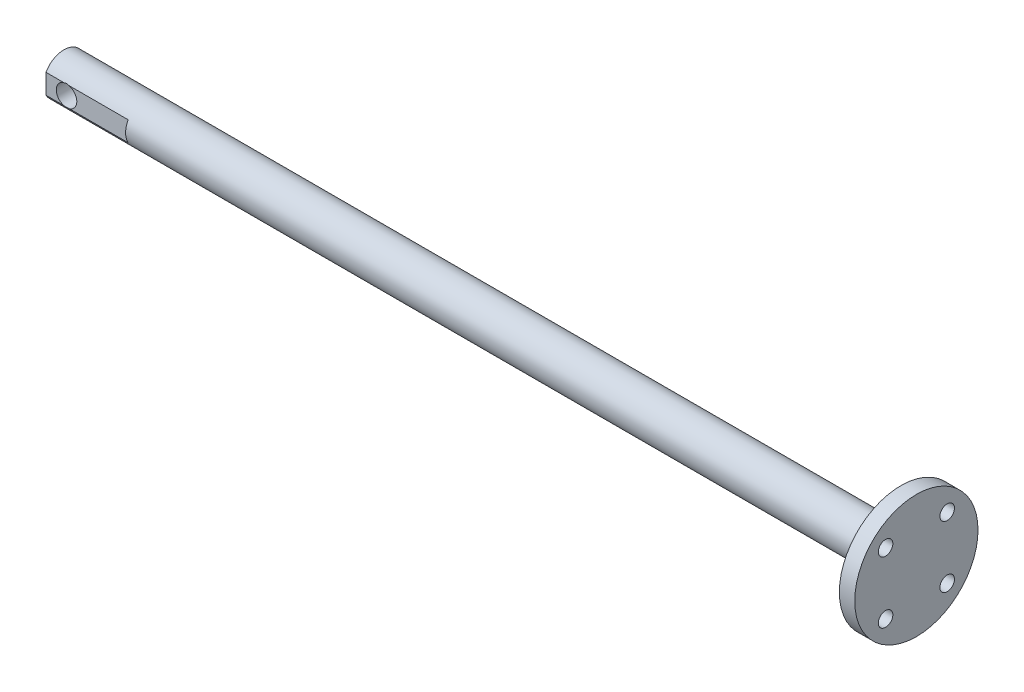
ISO-10303-21;
HEADER;
FILE_DESCRIPTION(('STEP AP214'),'2;1');
FILE_NAME('part.step','',(''),(''),'','','');
FILE_SCHEMA(('AUTOMOTIVE_DESIGN { 1 0 10303 214 1 1 1 1 }'));
ENDSEC;
DATA;
#1=APPLICATION_CONTEXT('core data for automotive mechanical design processes');
#2=APPLICATION_PROTOCOL_DEFINITION('international standard','automotive_design',2000,#1);
#3=PRODUCT_CONTEXT('',#1,'mechanical');
#4=PRODUCT('Part','Part','',(#3));
#5=PRODUCT_RELATED_PRODUCT_CATEGORY('part','',(#4));
#6=PRODUCT_DEFINITION_FORMATION('','',#4);
#7=PRODUCT_DEFINITION_CONTEXT('part definition',#1,'design');
#8=PRODUCT_DEFINITION('design','',#6,#7);
#9=PRODUCT_DEFINITION_SHAPE('','',#8);
#10=(LENGTH_UNIT() NAMED_UNIT(*) SI_UNIT(.MILLI.,.METRE.));
#11=(NAMED_UNIT(*) PLANE_ANGLE_UNIT() SI_UNIT($,.RADIAN.));
#12=(NAMED_UNIT(*) SI_UNIT($,.STERADIAN.) SOLID_ANGLE_UNIT());
#13=UNCERTAINTY_MEASURE_WITH_UNIT(LENGTH_MEASURE(1.E-05),#10,'distance_accuracy_value','');
#14=(GEOMETRIC_REPRESENTATION_CONTEXT(3) GLOBAL_UNCERTAINTY_ASSIGNED_CONTEXT((#13)) GLOBAL_UNIT_ASSIGNED_CONTEXT((#10,
#11,#12)) REPRESENTATION_CONTEXT('',''));
#15=CARTESIAN_POINT('',(0.,0.,0.));
#16=DIRECTION('',(0.,0.,1.));
#17=DIRECTION('',(1.,0.,0.));
#18=AXIS2_PLACEMENT_3D('',#15,#16,#17);
#19=CARTESIAN_POINT('',(0.,-19.05,-5.55625));
#20=DIRECTION('',(0.,0.,1.));
#21=DIRECTION('',(1.,0.,0.));
#22=AXIS2_PLACEMENT_3D('',#19,#20,#21);
#23=PLANE('',#22);
#24=CARTESIAN_POINT('',(6.35,0.,-5.55625));
#25=DIRECTION('',(0.,0.,-1.));
#26=DIRECTION('',(-1.,0.,0.));
#27=AXIS2_PLACEMENT_3D('',#24,#25,#26);
#28=CIRCLE('',#27,3.17499999999999);
#29=CARTESIAN_POINT('',(7.14374999999996,3.07418053105213,-5.55625));
#30=VERTEX_POINT('',#29);
#31=CARTESIAN_POINT('',(7.14374999999996,-3.07418053105213,-5.55625));
#32=VERTEX_POINT('',#31);
#33=EDGE_CURVE('E101',#30,#32,#28,.T.);
#34=ORIENTED_EDGE('',*,*,#33,.F.);
#35=DIRECTION('',(-1.,0.,0.));
#36=VECTOR('',#35,1.);
#37=CARTESIAN_POINT('',(-16.5206638695174,3.07418053105214,-5.55625));
#38=LINE('',#37,#36);
#39=CARTESIAN_POINT('',(25.4,3.07418053105213,-5.55625));
#40=VERTEX_POINT('',#39);
#41=EDGE_CURVE('E111',#30,#40,#38,.F.);
#42=ORIENTED_EDGE('',*,*,#41,.T.);
#43=DIRECTION('',(0.,1.,0.));
#44=VECTOR('',#43,1.);
#45=CARTESIAN_POINT('',(25.4,-19.05,-5.55625));
#46=LINE('',#45,#44);
#47=CARTESIAN_POINT('',(25.4,-3.07418053105215,-5.55625));
#48=VERTEX_POINT('',#47);
#49=EDGE_CURVE('E243',#48,#40,#46,.T.);
#50=ORIENTED_EDGE('',*,*,#49,.F.);
#51=DIRECTION('',(-1.,0.,0.));
#52=VECTOR('',#51,1.);
#53=CARTESIAN_POINT('',(-16.5206638695174,-3.07418053105214,-5.55625));
#54=LINE('',#53,#52);
#55=EDGE_CURVE('E114',#48,#32,#54,.T.);
#56=ORIENTED_EDGE('',*,*,#55,.T.);
#57=EDGE_LOOP('',(#34,#42,#50,#56));
#58=FACE_BOUND('',#57,.T.);
#59=ADVANCED_FACE('F33',(#58),#23,.F.);
#60=CARTESIAN_POINT('',(5.55625000000004,-3.07418053105213,-5.55625));
#61=VERTEX_POINT('',#60);
#62=CARTESIAN_POINT('',(5.55625000000006,3.07418053105214,-5.55625));
#63=VERTEX_POINT('',#62);
#64=EDGE_CURVE('E52',#61,#63,#28,.T.);
#65=ORIENTED_EDGE('',*,*,#64,.F.);
#66=CARTESIAN_POINT('',(0.,-3.07418053105214,-5.55625));
#67=VERTEX_POINT('',#66);
#68=EDGE_CURVE('E123',#61,#67,#54,.T.);
#69=ORIENTED_EDGE('',*,*,#68,.T.);
#70=DIRECTION('',(0.,-1.,0.));
#71=VECTOR('',#70,1.);
#72=CARTESIAN_POINT('',(0.,0.,-5.55625));
#73=LINE('',#72,#71);
#74=CARTESIAN_POINT('',(0.,3.07418053105213,-5.55625));
#75=VERTEX_POINT('',#74);
#76=EDGE_CURVE('E139',#75,#67,#73,.T.);
#77=ORIENTED_EDGE('',*,*,#76,.F.);
#78=EDGE_CURVE('E120',#75,#63,#38,.F.);
#79=ORIENTED_EDGE('',*,*,#78,.T.);
#80=EDGE_LOOP('',(#65,#69,#77,#79));
#81=FACE_BOUND('',#80,.T.);
#82=ADVANCED_FACE('F180',(#81),#23,.F.);
#83=CARTESIAN_POINT('',(0.,-19.05,5.55625));
#84=DIRECTION('',(0.,0.,-1.));
#85=DIRECTION('',(-1.,0.,0.));
#86=AXIS2_PLACEMENT_3D('',#83,#84,#85);
#87=PLANE('',#86);
#88=DIRECTION('',(-1.,0.,0.));
#89=VECTOR('',#88,1.);
#90=CARTESIAN_POINT('',(-16.5206638695174,3.07418053105214,5.55625));
#91=LINE('',#90,#89);
#92=CARTESIAN_POINT('',(25.4,3.07418053105214,5.55625));
#93=VERTEX_POINT('',#92);
#94=CARTESIAN_POINT('',(7.14374999999994,3.07418053105214,5.55625));
#95=VERTEX_POINT('',#94);
#96=EDGE_CURVE('E228',#93,#95,#91,.T.);
#97=ORIENTED_EDGE('',*,*,#96,.T.);
#98=CARTESIAN_POINT('',(6.35,0.,5.55625));
#99=DIRECTION('',(0.,0.,-1.));
#100=DIRECTION('',(-1.,0.,0.));
#101=AXIS2_PLACEMENT_3D('',#98,#99,#100);
#102=CIRCLE('',#101,3.17499999999999);
#103=CARTESIAN_POINT('',(7.14374999999994,-3.07418053105214,5.55625));
#104=VERTEX_POINT('',#103);
#105=EDGE_CURVE('E229',#95,#104,#102,.T.);
#106=ORIENTED_EDGE('',*,*,#105,.T.);
#107=DIRECTION('',(-1.,0.,0.));
#108=VECTOR('',#107,1.);
#109=CARTESIAN_POINT('',(-16.5206638695174,-3.07418053105214,5.55625));
#110=LINE('',#109,#108);
#111=CARTESIAN_POINT('',(25.4,-3.07418053105214,5.55625));
#112=VERTEX_POINT('',#111);
#113=EDGE_CURVE('E235',#104,#112,#110,.F.);
#114=ORIENTED_EDGE('',*,*,#113,.T.);
#115=DIRECTION('',(0.,1.,0.));
#116=VECTOR('',#115,1.);
#117=CARTESIAN_POINT('',(25.4,-19.05,5.55625));
#118=LINE('',#117,#116);
#119=EDGE_CURVE('E232',#112,#93,#118,.T.);
#120=ORIENTED_EDGE('',*,*,#119,.T.);
#121=EDGE_LOOP('',(#97,#106,#114,#120));
#122=FACE_BOUND('',#121,.T.);
#123=ADVANCED_FACE('F171',(#122),#87,.F.);
#124=CARTESIAN_POINT('',(263.525,0.,0.));
#125=DIRECTION('',(-1.,0.,0.));
#126=DIRECTION('',(0.,0.,1.));
#127=AXIS2_PLACEMENT_3D('',#124,#125,#126);
#128=CYLINDRICAL_SURFACE('',#127,19.05);
#129=CARTESIAN_POINT('',(263.525,0.,0.));
#130=DIRECTION('',(1.,0.,0.));
#131=DIRECTION('',(0.,0.,-1.));
#132=AXIS2_PLACEMENT_3D('',#129,#130,#131);
#133=CIRCLE('',#132,19.05);
#134=CARTESIAN_POINT('',(263.525,0.,-19.05));
#135=VERTEX_POINT('',#134);
#136=EDGE_CURVE('E136',#135,#135,#133,.T.);
#137=ORIENTED_EDGE('',*,*,#136,.F.);
#138=EDGE_LOOP('',(#137));
#139=FACE_BOUND('',#138,.T.);
#140=CARTESIAN_POINT('',(258.7625,0.,0.));
#141=DIRECTION('',(-1.,0.,0.));
#142=DIRECTION('',(0.,0.,1.));
#143=AXIS2_PLACEMENT_3D('',#140,#141,#142);
#144=CIRCLE('',#143,19.05);
#145=CARTESIAN_POINT('',(258.7625,0.,19.05));
#146=VERTEX_POINT('',#145);
#147=EDGE_CURVE('E122',#146,#146,#144,.T.);
#148=ORIENTED_EDGE('',*,*,#147,.F.);
#149=EDGE_LOOP('',(#148));
#150=FACE_BOUND('',#149,.T.);
#151=ADVANCED_FACE('F35',(#139,#150),#128,.T.);
#152=CARTESIAN_POINT('',(263.525,0.,0.));
#153=DIRECTION('',(1.,0.,0.));
#154=DIRECTION('',(0.,0.,-1.));
#155=AXIS2_PLACEMENT_3D('',#152,#153,#154);
#156=PLANE('',#155);
#157=CARTESIAN_POINT('',(263.525,9.525,9.525));
#158=DIRECTION('',(1.,0.,0.));
#159=DIRECTION('',(0.,0.,-1.));
#160=AXIS2_PLACEMENT_3D('',#157,#158,#159);
#161=CIRCLE('',#160,2.2479);
#162=CARTESIAN_POINT('',(263.525,9.525,7.27710000000001));
#163=VERTEX_POINT('',#162);
#164=EDGE_CURVE('E263',#163,#163,#161,.T.);
#165=ORIENTED_EDGE('',*,*,#164,.F.);
#166=EDGE_LOOP('',(#165));
#167=FACE_BOUND('',#166,.T.);
#168=CARTESIAN_POINT('',(263.525,-9.525,-9.525));
#169=DIRECTION('',(1.,0.,0.));
#170=DIRECTION('',(0.,0.,-1.));
#171=AXIS2_PLACEMENT_3D('',#168,#169,#170);
#172=CIRCLE('',#171,2.2479);
#173=CARTESIAN_POINT('',(263.525,-9.525,-11.7729));
#174=VERTEX_POINT('',#173);
#175=EDGE_CURVE('E259',#174,#174,#172,.T.);
#176=ORIENTED_EDGE('',*,*,#175,.F.);
#177=EDGE_LOOP('',(#176));
#178=FACE_BOUND('',#177,.T.);
#179=CARTESIAN_POINT('',(263.525,9.525,-9.525));
#180=DIRECTION('',(1.,0.,0.));
#181=DIRECTION('',(0.,0.,-1.));
#182=AXIS2_PLACEMENT_3D('',#179,#180,#181);
#183=CIRCLE('',#182,2.2479);
#184=CARTESIAN_POINT('',(263.525,9.525,-11.7729));
#185=VERTEX_POINT('',#184);
#186=EDGE_CURVE('E255',#185,#185,#183,.T.);
#187=ORIENTED_EDGE('',*,*,#186,.F.);
#188=EDGE_LOOP('',(#187));
#189=FACE_BOUND('',#188,.T.);
#190=CARTESIAN_POINT('',(263.525,-9.525,9.525));
#191=DIRECTION('',(1.,0.,0.));
#192=DIRECTION('',(0.,0.,-1.));
#193=AXIS2_PLACEMENT_3D('',#190,#191,#192);
#194=CIRCLE('',#193,2.2479);
#195=CARTESIAN_POINT('',(263.525,-9.525,7.27710000000001));
#196=VERTEX_POINT('',#195);
#197=EDGE_CURVE('E251',#196,#196,#194,.T.);
#198=ORIENTED_EDGE('',*,*,#197,.F.);
#199=EDGE_LOOP('',(#198));
#200=FACE_BOUND('',#199,.T.);
#201=ORIENTED_EDGE('',*,*,#136,.T.);
#202=EDGE_LOOP('',(#201));
#203=FACE_BOUND('',#202,.T.);
#204=ADVANCED_FACE('F189',(#167,#178,#189,#200,#203),#156,.T.);
#205=CARTESIAN_POINT('',(-16.5206638695174,0.,0.));
#206=DIRECTION('',(-1.,0.,0.));
#207=DIRECTION('',(0.,0.,1.));
#208=AXIS2_PLACEMENT_3D('',#205,#206,#207);
#209=CYLINDRICAL_SURFACE('',#208,6.35);
#210=CARTESIAN_POINT('',(7.14374999999996,-3.07418053105214,-5.55625));
#211=CARTESIAN_POINT('',(7.06724573834244,-3.09394573682989,-5.54530326829618));
#212=CARTESIAN_POINT('',(6.98979244902954,-3.11088593896028,-5.53580306432637));
#213=CARTESIAN_POINT('',(6.83349752086504,-3.1389716298177,-5.51993211680947));
#214=CARTESIAN_POINT('',(6.7546553624178,-3.15011490009601,-5.51356257139676));
#215=CARTESIAN_POINT('',(6.59805268366542,-3.16625080572854,-5.50431039399035));
#216=CARTESIAN_POINT('',(6.52031157965077,-3.17138455989439,-5.50134778906265));
#217=CARTESIAN_POINT('',(6.3646484706526,-3.17592115020808,-5.49872994876561));
#218=CARTESIAN_POINT('',(6.28672654637229,-3.17532618088666,-5.49907344691083));
#219=CARTESIAN_POINT('',(6.09942029753634,-3.16699163319004,-5.50388144041737));
#220=CARTESIAN_POINT('',(5.9901801183416,-3.15643410467398,-5.50997127067524));
#221=CARTESIAN_POINT('',(5.827087752603,-3.13213839515719,-5.52379304067881));
#222=CARTESIAN_POINT('',(5.77237979871466,-3.12250817982089,-5.52924997394033));
#223=CARTESIAN_POINT('',(5.66371738369593,-3.10043723768752,-5.54165560495079));
#224=CARTESIAN_POINT('',(5.60976275500805,-3.08799714679888,-5.54860396515432));
#225=CARTESIAN_POINT('',(5.55625000000004,-3.07418053105214,-5.55625));
#226=B_SPLINE_CURVE_WITH_KNOTS('',3,(#210,#211,#212,#213,#214,#215,#216,#217,#218,#219,#220,
#221,#222,#223,#224,#225),.UNSPECIFIED.,.F.,.F.,(4,2,2,2,2,2,2,4),(0.,0.239262180475478,
0.478615857822642,0.712228367182657,0.945751388992468,1.27462161298976,1.44199117350151,
1.60932289416568),.UNSPECIFIED.);
#227=EDGE_CURVE('E11',#32,#61,#226,.T.);
#228=ORIENTED_EDGE('',*,*,#227,.F.);
#229=ORIENTED_EDGE('',*,*,#55,.F.);
#230=CARTESIAN_POINT('',(25.4,0.,0.));
#231=DIRECTION('',(1.,0.,0.));
#232=DIRECTION('',(0.,0.,-1.));
#233=AXIS2_PLACEMENT_3D('',#230,#231,#232);
#234=CIRCLE('',#233,6.35);
#235=EDGE_CURVE('E118',#40,#48,#234,.F.);
#236=ORIENTED_EDGE('',*,*,#235,.F.);
#237=ORIENTED_EDGE('',*,*,#41,.F.);
#238=CARTESIAN_POINT('',(5.55625000000004,3.07418053105214,-5.55625));
#239=CARTESIAN_POINT('',(5.63275426165756,3.09394573682989,-5.54530326829618));
#240=CARTESIAN_POINT('',(5.71020755097046,3.11088593896028,-5.53580306432637));
#241=CARTESIAN_POINT('',(5.86650247913496,3.1389716298177,-5.51993211680947));
#242=CARTESIAN_POINT('',(5.9453446375822,3.15011490009601,-5.51356257139676));
#243=CARTESIAN_POINT('',(6.10194731633458,3.16625080572854,-5.50431039399035));
#244=CARTESIAN_POINT('',(6.17968842034923,3.17138455989439,-5.50134778906265));
#245=CARTESIAN_POINT('',(6.3353515293474,3.17592115020808,-5.49872994876561));
#246=CARTESIAN_POINT('',(6.41327345362771,3.17532618088666,-5.49907344691083));
#247=CARTESIAN_POINT('',(6.60057970246366,3.16699163319004,-5.50388144041737));
#248=CARTESIAN_POINT('',(6.7098198816584,3.15643410467398,-5.50997127067524));
#249=CARTESIAN_POINT('',(6.872912247397,3.13213839515719,-5.52379304067881));
#250=CARTESIAN_POINT('',(6.92762020128534,3.12250817982089,-5.52924997394033));
#251=CARTESIAN_POINT('',(7.03628261630407,3.10043723768752,-5.54165560495079));
#252=CARTESIAN_POINT('',(7.09023724499195,3.08799714679888,-5.54860396515432));
#253=CARTESIAN_POINT('',(7.14374999999996,3.07418053105214,-5.55625));
#254=B_SPLINE_CURVE_WITH_KNOTS('',3,(#238,#239,#240,#241,#242,#243,#244,#245,#246,#247,#248,
#249,#250,#251,#252,#253),.UNSPECIFIED.,.F.,.F.,(4,2,2,2,2,2,2,4),(0.,0.239262180475478,
0.478615857822642,0.712228367182656,0.945751388992468,1.27462161298976,1.44199117350151,
1.60932289416568),.UNSPECIFIED.);
#255=EDGE_CURVE('E46',#63,#30,#254,.T.);
#256=ORIENTED_EDGE('',*,*,#255,.F.);
#257=ORIENTED_EDGE('',*,*,#78,.F.);
#258=CARTESIAN_POINT('',(0.,0.,0.));
#259=DIRECTION('',(-1.,0.,0.));
#260=DIRECTION('',(0.,0.,1.));
#261=AXIS2_PLACEMENT_3D('',#258,#259,#260);
#262=CIRCLE('',#261,6.35);
#263=CARTESIAN_POINT('',(0.,3.07418053105214,5.55625));
#264=VERTEX_POINT('',#263);
#265=EDGE_CURVE('E132',#264,#75,#262,.T.);
#266=ORIENTED_EDGE('',*,*,#265,.F.);
#267=CARTESIAN_POINT('',(5.55625000000006,3.07418053105214,5.55625));
#268=VERTEX_POINT('',#267);
#269=EDGE_CURVE('E236',#268,#264,#91,.T.);
#270=ORIENTED_EDGE('',*,*,#269,.F.);
#271=CARTESIAN_POINT('',(9.52499999999999,0.,6.35));
#272=CARTESIAN_POINT('',(9.52499911228236,0.0834969220594995,6.34999931166444));
#273=CARTESIAN_POINT('',(9.52170012555403,0.167002655580041,6.34834758911701));
#274=CARTESIAN_POINT('',(9.50855412545009,0.33337833025878,6.34179105821714));
#275=CARTESIAN_POINT('',(9.49870426347422,0.41624797895577,6.33688483467113));
#276=CARTESIAN_POINT('',(9.45942793495398,0.663182030647008,6.31742426748325));
#277=CARTESIAN_POINT('',(9.42027492259859,0.825450146761551,6.29812827299425));
#278=CARTESIAN_POINT('',(9.31800928870584,1.13965128900425,6.2489182313574));
#279=CARTESIAN_POINT('',(9.25498978075658,1.29162180811868,6.21904547786825));
#280=CARTESIAN_POINT('',(9.10726392637109,1.58264035037879,6.15142812041637));
#281=CARTESIAN_POINT('',(9.02255928984903,1.72168939123018,6.11368413715877));
#282=CARTESIAN_POINT('',(8.82803037026577,1.99234108848171,6.03111096182982));
#283=CARTESIAN_POINT('',(8.71699642220606,2.12298433900091,5.98599127270818));
#284=CARTESIAN_POINT('',(8.4756033164272,2.36467069069853,5.89470535591056));
#285=CARTESIAN_POINT('',(8.34522957023355,2.4756988560132,5.84853836069044));
#286=CARTESIAN_POINT('',(8.05657905224668,2.68368848497885,5.75623634934465));
#287=CARTESIAN_POINT('',(7.8969224686984,2.77889135161933,5.71038146176788));
#288=CARTESIAN_POINT('',(7.64545201282556,2.90019349951533,5.64919759286364));
#289=CARTESIAN_POINT('',(7.55959993817132,2.93705266116891,5.63006420805933));
#290=CARTESIAN_POINT('',(7.38441438629357,3.00322508739605,5.59504604853268));
#291=CARTESIAN_POINT('',(7.29508300181944,3.03254280972158,5.57915935583429));
#292=CARTESIAN_POINT('',(7.11898944803525,3.08174263292981,5.55212611635049));
#293=CARTESIAN_POINT('',(7.03238920597143,3.10208128111977,5.54075429137746));
#294=CARTESIAN_POINT('',(6.8574127210056,3.13545600360764,5.52193654886445));
#295=CARTESIAN_POINT('',(6.7690374462283,3.14849595237256,5.51448854851136));
#296=CARTESIAN_POINT('',(6.59129326115138,3.16707713053439,5.50383875782919));
#297=CARTESIAN_POINT('',(6.5019249820126,3.17262287599648,5.50063441026522));
#298=CARTESIAN_POINT('',(6.32301921582191,3.17614778806992,5.4985978839861));
#299=CARTESIAN_POINT('',(6.23348174572866,3.1741276765987,5.49976528812799));
#300=CARTESIAN_POINT('',(5.98725212427559,3.15811930330259,5.50899190362733));
#301=CARTESIAN_POINT('',(5.83115827018664,3.13621253452964,5.52160857357708));
#302=CARTESIAN_POINT('',(5.52535335869347,3.07003746372167,5.55866493052825));
#303=CARTESIAN_POINT('',(5.37564435097724,3.02576203854503,5.58310838358077));
#304=CARTESIAN_POINT('',(5.08245570343586,2.91531509833646,5.64157885407237));
#305=CARTESIAN_POINT('',(4.93920239006338,2.84865758129416,5.6758158387613));
#306=CARTESIAN_POINT('',(4.66523391382599,2.69570761526053,5.75003268807633));
#307=CARTESIAN_POINT('',(4.5345244203915,2.60940634674628,5.79001512927804));
#308=CARTESIAN_POINT('',(4.27189572574971,2.40685964249564,5.87734289018611));
#309=CARTESIAN_POINT('',(4.1419246151435,2.28820488335252,5.92497898403936));
#310=CARTESIAN_POINT('',(3.90291485713616,2.03058898448426,6.01813700574905));
#311=CARTESIAN_POINT('',(3.79388621364131,1.89161819563545,6.06365791538158));
#312=CARTESIAN_POINT('',(3.59509808028029,1.58913989972482,6.1500381059768));
#313=CARTESIAN_POINT('',(3.50646851442007,1.42479265164788,6.19058274974572));
#314=CARTESIAN_POINT('',(3.35884191836466,1.08098023585582,6.25976272299952));
#315=CARTESIAN_POINT('',(3.2998213588683,0.901527205073891,6.28840750578946));
#316=CARTESIAN_POINT('',(3.21794059660096,0.54853361062683,6.32854759690357));
#317=CARTESIAN_POINT('',(3.19249032741267,0.375734359385242,6.34126679122995));
#318=CARTESIAN_POINT('',(3.17034947773975,0.0278752299448297,6.35231817716325));
#319=CARTESIAN_POINT('',(3.17364527286069,-0.14718353806002,6.35065718436129));
#320=CARTESIAN_POINT('',(3.2074062359454,-0.480164686080363,6.33384535408399));
#321=CARTESIAN_POINT('',(3.23574579147485,-0.638363620564189,6.31975005060431));
#322=CARTESIAN_POINT('',(3.31545587820991,-0.947441883053,6.28085393924121));
#323=CARTESIAN_POINT('',(3.3668289484773,-1.09832040207141,6.25605195113515));
#324=CARTESIAN_POINT('',(3.49249513093781,-1.39347133182512,6.19709998236334));
#325=CARTESIAN_POINT('',(3.56740158411121,-1.53743151047822,6.16270299610718));
#326=CARTESIAN_POINT('',(3.73731642568589,-1.8112148234104,6.08787118465665));
#327=CARTESIAN_POINT('',(3.83233337738542,-1.94103189959927,6.0474337895468));
#328=CARTESIAN_POINT('',(4.05053935037378,-2.19636241342679,5.95973602709939));
#329=CARTESIAN_POINT('',(4.17557860711158,-2.32020134681979,5.91219559251098));
#330=CARTESIAN_POINT('',(4.44476235514976,-2.54589381918873,5.81858093231368));
#331=CARTESIAN_POINT('',(4.58891995238094,-2.6477321493525,5.77250773963547));
#332=CARTESIAN_POINT('',(4.90106860195836,-2.83117262876715,5.68487535288742));
#333=CARTESIAN_POINT('',(5.06987576951039,-2.91155594998013,5.64364281441822));
#334=CARTESIAN_POINT('',(5.42134446488968,-3.04191297152938,5.5744767953732));
#335=CARTESIAN_POINT('',(5.60398779784739,-3.09192585492219,5.54652618900869));
#336=CARTESIAN_POINT('',(5.95918995647017,-3.15551086037917,5.51057765714603));
#337=CARTESIAN_POINT('',(6.13103375040722,-3.1721202730971,5.50092192343245));
#338=CARTESIAN_POINT('',(6.47524444249521,-3.17718805563875,5.49800001145359));
#339=CARTESIAN_POINT('',(6.64761108154264,-3.16565862768384,5.50472672904441));
#340=CARTESIAN_POINT('',(6.97066010307391,-3.11761548073657,5.53205211477785));
#341=CARTESIAN_POINT('',(7.12184394173115,-3.08358651207685,5.5512682307627));
#342=CARTESIAN_POINT('',(7.41619083016717,-2.99458164828806,5.59977978302582));
#343=CARTESIAN_POINT('',(7.5593512828503,-2.93959901505998,5.62907846127336));
#344=CARTESIAN_POINT('',(7.84423369942855,-2.80611544421369,5.69685576337175));
#345=CARTESIAN_POINT('',(7.98521280936567,-2.72628260503928,5.73581889480533));
#346=CARTESIAN_POINT('',(8.2526974317231,-2.54682759156582,5.81772207082383));
#347=CARTESIAN_POINT('',(8.3791953599427,-2.4471951216993,5.86066417820131));
#348=CARTESIAN_POINT('',(8.63009752417706,-2.21680287661217,5.95192753761204));
#349=CARTESIAN_POINT('',(8.75237975641279,-2.08373188558711,6.00026839877347));
#350=CARTESIAN_POINT('',(8.97339787323311,-1.79751265125242,6.0921234557675));
#351=CARTESIAN_POINT('',(9.07212106598271,-1.64435365457427,6.13563504323043));
#352=CARTESIAN_POINT('',(9.20028026619706,-1.40178715704486,6.19391073190243));
#353=CARTESIAN_POINT('',(9.23980058368138,-1.31842200030917,6.21223173271384));
#354=CARTESIAN_POINT('',(9.31159947482369,-1.14807701021669,6.24595363475604));
#355=CARTESIAN_POINT('',(9.34388160653436,-1.06109897786305,6.26135597012704));
#356=CARTESIAN_POINT('',(9.40075934591499,-0.884361322813098,6.28875097111981));
#357=CARTESIAN_POINT('',(9.4253717181381,-0.794608244970563,6.30075106809478));
#358=CARTESIAN_POINT('',(9.46666738952988,-0.612925661591574,6.32100983571903));
#359=CARTESIAN_POINT('',(9.48335553219353,-0.520997521680282,6.3292707916836));
#360=CARTESIAN_POINT('',(9.50561628486238,-0.357531347524369,6.34032503263334));
#361=CARTESIAN_POINT('',(9.51287882124962,-0.286274046488592,6.34394670812889));
#362=CARTESIAN_POINT('',(9.52257112653756,-0.143346668941345,6.34878452045567));
#363=CARTESIAN_POINT('',(9.52500076204682,-0.0716765810914249,6.35000059089052));
#364=CARTESIAN_POINT('',(9.52499999999999,0.,6.35));
#365=B_SPLINE_CURVE_WITH_KNOTS('',3,(#271,#272,#273,#274,#275,#276,#277,#278,#279,#280,#281,
#282,#283,#284,#285,#286,#287,#288,#289,#290,#291,#292,#293,#294,#295,#296,#297,#298,#299,#300,
#301,#302,#303,#304,#305,#306,#307,#308,#309,#310,#311,#312,#313,#314,#315,#316,#317,#318,#319,
#320,#321,#322,#323,#324,#325,#326,#327,#328,#329,#330,#331,#332,#333,#334,#335,#336,#337,#338,
#339,#340,#341,#342,#343,#344,#345,#346,#347,#348,#349,#350,#351,#352,#353,#354,#355,#356,#357,
#358,#359,#360,#361,#362,#363,#364),.UNSPECIFIED.,.T.,.F.,(4,2,2,2,2,2,2,2,2,2,2,2,2,2,2,2,2,2,
2,2,2,2,2,2,2,2,2,2,2,2,2,2,2,2,2,2,2,2,2,2,2,2,2,2,2,2,4),(0.,0.250415612102679,
0.500940186864012,1.00234854488128,1.50182051324263,2.00125310940106,2.53090025348451,
3.06094897410614,3.63210298373097,3.91787290005987,4.20347350732848,4.47213270490101,
4.74064915090146,5.00900371453885,5.27733267302574,5.74927594687736,6.22136960256844,
6.70445970327762,7.18776712794018,7.73235646527878,8.27720530143643,8.84735553323663,
9.41705196489301,9.93956405039335,10.4618285011675,10.9436138594975,11.4254523397102,
11.9210677568139,12.4168946391879,12.9614122158798,13.5063050164601,14.0775857365549,
14.6481278321882,15.1639000911418,15.6794487286236,16.1458838633213,16.6124691169502,
17.1104020806942,17.6085946442304,18.1673210354481,18.7263477502426,19.0082017078364,
19.2899168101042,19.5710117490932,19.8519346536843,20.0668939492147,20.2818591776892),.UNSPECIFIED.);
#366=EDGE_CURVE('E107',#95,#268,#365,.T.);
#367=ORIENTED_EDGE('',*,*,#366,.F.);
#368=ORIENTED_EDGE('',*,*,#96,.F.);
#369=CARTESIAN_POINT('',(25.4,0.,0.));
#370=DIRECTION('',(1.,0.,0.));
#371=DIRECTION('',(0.,0.,-1.));
#372=AXIS2_PLACEMENT_3D('',#369,#370,#371);
#373=CIRCLE('',#372,6.35);
#374=EDGE_CURVE('E146',#112,#93,#373,.F.);
#375=ORIENTED_EDGE('',*,*,#374,.F.);
#376=ORIENTED_EDGE('',*,*,#113,.F.);
#377=CARTESIAN_POINT('',(5.55625000000006,-3.07418053105214,5.55625));
#378=VERTEX_POINT('',#377);
#379=EDGE_CURVE('E148',#378,#104,#365,.T.);
#380=ORIENTED_EDGE('',*,*,#379,.F.);
#381=CARTESIAN_POINT('',(0.,-3.07418053105215,5.55625));
#382=VERTEX_POINT('',#381);
#383=EDGE_CURVE('E238',#382,#378,#110,.F.);
#384=ORIENTED_EDGE('',*,*,#383,.F.);
#385=EDGE_CURVE('E133',#67,#382,#262,.T.);
#386=ORIENTED_EDGE('',*,*,#385,.F.);
#387=ORIENTED_EDGE('',*,*,#68,.F.);
#388=EDGE_LOOP('',(#228,#229,#236,#237,#256,#257,#266,#270,#367,#368,#375,#376,#380,#384,#386,#387));
#389=FACE_BOUND('',#388,.T.);
#390=CARTESIAN_POINT('',(258.7625,0.,0.));
#391=DIRECTION('',(-1.,0.,0.));
#392=DIRECTION('',(0.,0.,1.));
#393=AXIS2_PLACEMENT_3D('',#390,#391,#392);
#394=CIRCLE('',#393,6.35);
#395=CARTESIAN_POINT('',(258.7625,0.,6.35));
#396=VERTEX_POINT('',#395);
#397=EDGE_CURVE('E129',#396,#396,#394,.T.);
#398=ORIENTED_EDGE('',*,*,#397,.T.);
#399=EDGE_LOOP('',(#398));
#400=FACE_BOUND('',#399,.T.);
#401=ADVANCED_FACE('F116',(#389,#400),#209,.T.);
#402=CARTESIAN_POINT('',(258.7625,6.35,0.));
#403=DIRECTION('',(-1.,0.,0.));
#404=DIRECTION('',(0.,0.,1.));
#405=AXIS2_PLACEMENT_3D('',#402,#403,#404);
#406=PLANE('',#405);
#407=CARTESIAN_POINT('',(258.7625,9.525,9.525));
#408=DIRECTION('',(-1.,0.,0.));
#409=DIRECTION('',(0.,0.,1.));
#410=AXIS2_PLACEMENT_3D('',#407,#408,#409);
#411=CIRCLE('',#410,2.2479);
#412=CARTESIAN_POINT('',(258.7625,9.525,11.7729));
#413=VERTEX_POINT('',#412);
#414=EDGE_CURVE('E193',#413,#413,#411,.T.);
#415=ORIENTED_EDGE('',*,*,#414,.F.);
#416=EDGE_LOOP('',(#415));
#417=FACE_BOUND('',#416,.T.);
#418=CARTESIAN_POINT('',(258.7625,-9.525,-9.525));
#419=DIRECTION('',(-1.,0.,0.));
#420=DIRECTION('',(0.,0.,1.));
#421=AXIS2_PLACEMENT_3D('',#418,#419,#420);
#422=CIRCLE('',#421,2.2479);
#423=CARTESIAN_POINT('',(258.7625,-9.525,-7.2771));
#424=VERTEX_POINT('',#423);
#425=EDGE_CURVE('E197',#424,#424,#422,.T.);
#426=ORIENTED_EDGE('',*,*,#425,.F.);
#427=EDGE_LOOP('',(#426));
#428=FACE_BOUND('',#427,.T.);
#429=CARTESIAN_POINT('',(258.7625,9.525,-9.525));
#430=DIRECTION('',(-1.,0.,0.));
#431=DIRECTION('',(0.,0.,1.));
#432=AXIS2_PLACEMENT_3D('',#429,#430,#431);
#433=CIRCLE('',#432,2.2479);
#434=CARTESIAN_POINT('',(258.7625,9.525,-7.2771));
#435=VERTEX_POINT('',#434);
#436=EDGE_CURVE('E201',#435,#435,#433,.T.);
#437=ORIENTED_EDGE('',*,*,#436,.F.);
#438=EDGE_LOOP('',(#437));
#439=FACE_BOUND('',#438,.T.);
#440=CARTESIAN_POINT('',(258.7625,-9.525,9.525));
#441=DIRECTION('',(-1.,0.,0.));
#442=DIRECTION('',(0.,0.,1.));
#443=AXIS2_PLACEMENT_3D('',#440,#441,#442);
#444=CIRCLE('',#443,2.2479);
#445=CARTESIAN_POINT('',(258.7625,-9.525,11.7729));
#446=VERTEX_POINT('',#445);
#447=EDGE_CURVE('E205',#446,#446,#444,.T.);
#448=ORIENTED_EDGE('',*,*,#447,.F.);
#449=EDGE_LOOP('',(#448));
#450=FACE_BOUND('',#449,.T.);
#451=ORIENTED_EDGE('',*,*,#147,.T.);
#452=EDGE_LOOP('',(#451));
#453=FACE_BOUND('',#452,.T.);
#454=ORIENTED_EDGE('',*,*,#397,.F.);
#455=EDGE_LOOP('',(#454));
#456=FACE_BOUND('',#455,.T.);
#457=ADVANCED_FACE('F181',(#417,#428,#439,#450,#453,#456),#406,.T.);
#458=CARTESIAN_POINT('',(0.,0.,0.));
#459=DIRECTION('',(1.,0.,0.));
#460=DIRECTION('',(0.,0.,-1.));
#461=AXIS2_PLACEMENT_3D('',#458,#459,#460);
#462=PLANE('',#461);
#463=ORIENTED_EDGE('',*,*,#385,.T.);
#464=DIRECTION('',(0.,1.,0.));
#465=VECTOR('',#464,1.);
#466=CARTESIAN_POINT('',(0.,0.,5.55625));
#467=LINE('',#466,#465);
#468=EDGE_CURVE('E143',#382,#264,#467,.T.);
#469=ORIENTED_EDGE('',*,*,#468,.T.);
#470=ORIENTED_EDGE('',*,*,#265,.T.);
#471=ORIENTED_EDGE('',*,*,#76,.T.);
#472=EDGE_LOOP('',(#463,#469,#470,#471));
#473=FACE_BOUND('',#472,.T.);
#474=ADVANCED_FACE('F177',(#473),#462,.F.);
#475=CARTESIAN_POINT('',(25.4,-19.05,-6.35));
#476=DIRECTION('',(1.,0.,0.));
#477=DIRECTION('',(0.,0.,-1.));
#478=AXIS2_PLACEMENT_3D('',#475,#476,#477);
#479=PLANE('',#478);
#480=ORIENTED_EDGE('',*,*,#235,.T.);
#481=ORIENTED_EDGE('',*,*,#49,.T.);
#482=EDGE_LOOP('',(#480,#481));
#483=FACE_BOUND('',#482,.T.);
#484=ADVANCED_FACE('F169',(#483),#479,.F.);
#485=ORIENTED_EDGE('',*,*,#383,.T.);
#486=EDGE_CURVE('E60',#378,#268,#102,.T.);
#487=ORIENTED_EDGE('',*,*,#486,.T.);
#488=ORIENTED_EDGE('',*,*,#269,.T.);
#489=ORIENTED_EDGE('',*,*,#468,.F.);
#490=EDGE_LOOP('',(#485,#487,#488,#489));
#491=FACE_BOUND('',#490,.T.);
#492=ADVANCED_FACE('F164',(#491),#87,.F.);
#493=CARTESIAN_POINT('',(25.4,-19.05,6.35));
#494=DIRECTION('',(1.,0.,0.));
#495=DIRECTION('',(0.,0.,-1.));
#496=AXIS2_PLACEMENT_3D('',#493,#494,#495);
#497=PLANE('',#496);
#498=ORIENTED_EDGE('',*,*,#119,.F.);
#499=ORIENTED_EDGE('',*,*,#374,.T.);
#500=EDGE_LOOP('',(#498,#499));
#501=FACE_BOUND('',#500,.T.);
#502=ADVANCED_FACE('F162',(#501),#497,.F.);
#503=CARTESIAN_POINT('',(6.35,0.,-5.55625));
#504=DIRECTION('',(0.,0.,-1.));
#505=DIRECTION('',(-1.,0.,0.));
#506=AXIS2_PLACEMENT_3D('',#503,#504,#505);
#507=CYLINDRICAL_SURFACE('',#506,3.17499999999999);
#508=ORIENTED_EDGE('',*,*,#227,.T.);
#509=ORIENTED_EDGE('',*,*,#64,.T.);
#510=ORIENTED_EDGE('',*,*,#255,.T.);
#511=ORIENTED_EDGE('',*,*,#33,.T.);
#512=EDGE_LOOP('',(#508,#509,#510,#511));
#513=FACE_BOUND('',#512,.T.);
#514=ORIENTED_EDGE('',*,*,#366,.T.);
#515=ORIENTED_EDGE('',*,*,#486,.F.);
#516=ORIENTED_EDGE('',*,*,#379,.T.);
#517=ORIENTED_EDGE('',*,*,#105,.F.);
#518=EDGE_LOOP('',(#514,#515,#516,#517));
#519=FACE_BOUND('',#518,.T.);
#520=ADVANCED_FACE('F100',(#513,#519),#507,.F.);
#521=CARTESIAN_POINT('',(258.7625,-9.525,9.525));
#522=DIRECTION('',(-1.,0.,0.));
#523=DIRECTION('',(0.,0.,1.));
#524=AXIS2_PLACEMENT_3D('',#521,#522,#523);
#525=CYLINDRICAL_SURFACE('',#524,2.2479);
#526=ORIENTED_EDGE('',*,*,#197,.T.);
#527=EDGE_LOOP('',(#526));
#528=FACE_BOUND('',#527,.T.);
#529=ORIENTED_EDGE('',*,*,#447,.T.);
#530=EDGE_LOOP('',(#529));
#531=FACE_BOUND('',#530,.T.);
#532=ADVANCED_FACE('F161',(#528,#531),#525,.F.);
#533=CARTESIAN_POINT('',(258.7625,9.525,-9.525));
#534=DIRECTION('',(-1.,0.,0.));
#535=DIRECTION('',(0.,0.,1.));
#536=AXIS2_PLACEMENT_3D('',#533,#534,#535);
#537=CYLINDRICAL_SURFACE('',#536,2.2479);
#538=ORIENTED_EDGE('',*,*,#186,.T.);
#539=EDGE_LOOP('',(#538));
#540=FACE_BOUND('',#539,.T.);
#541=ORIENTED_EDGE('',*,*,#436,.T.);
#542=EDGE_LOOP('',(#541));
#543=FACE_BOUND('',#542,.T.);
#544=ADVANCED_FACE('F275',(#540,#543),#537,.F.);
#545=CARTESIAN_POINT('',(258.7625,-9.525,-9.525));
#546=DIRECTION('',(-1.,0.,0.));
#547=DIRECTION('',(0.,0.,1.));
#548=AXIS2_PLACEMENT_3D('',#545,#546,#547);
#549=CYLINDRICAL_SURFACE('',#548,2.2479);
#550=ORIENTED_EDGE('',*,*,#175,.T.);
#551=EDGE_LOOP('',(#550));
#552=FACE_BOUND('',#551,.T.);
#553=ORIENTED_EDGE('',*,*,#425,.T.);
#554=EDGE_LOOP('',(#553));
#555=FACE_BOUND('',#554,.T.);
#556=ADVANCED_FACE('F269',(#552,#555),#549,.F.);
#557=CARTESIAN_POINT('',(258.7625,9.525,9.525));
#558=DIRECTION('',(-1.,0.,0.));
#559=DIRECTION('',(0.,0.,1.));
#560=AXIS2_PLACEMENT_3D('',#557,#558,#559);
#561=CYLINDRICAL_SURFACE('',#560,2.2479);
#562=ORIENTED_EDGE('',*,*,#164,.T.);
#563=EDGE_LOOP('',(#562));
#564=FACE_BOUND('',#563,.T.);
#565=ORIENTED_EDGE('',*,*,#414,.T.);
#566=EDGE_LOOP('',(#565));
#567=FACE_BOUND('',#566,.T.);
#568=ADVANCED_FACE('F267',(#564,#567),#561,.F.);
#569=CLOSED_SHELL('',(#59,#82,#123,#151,#204,#401,#457,#474,#484,#492,#502,#520,#532,#544,#556,#568));
#570=MANIFOLD_SOLID_BREP('B2',#569);
#571=ADVANCED_BREP_SHAPE_REPRESENTATION('',(#18,#570),#14);
#572=SHAPE_DEFINITION_REPRESENTATION(#9,#571);
ENDSEC;
END-ISO-10303-21;
